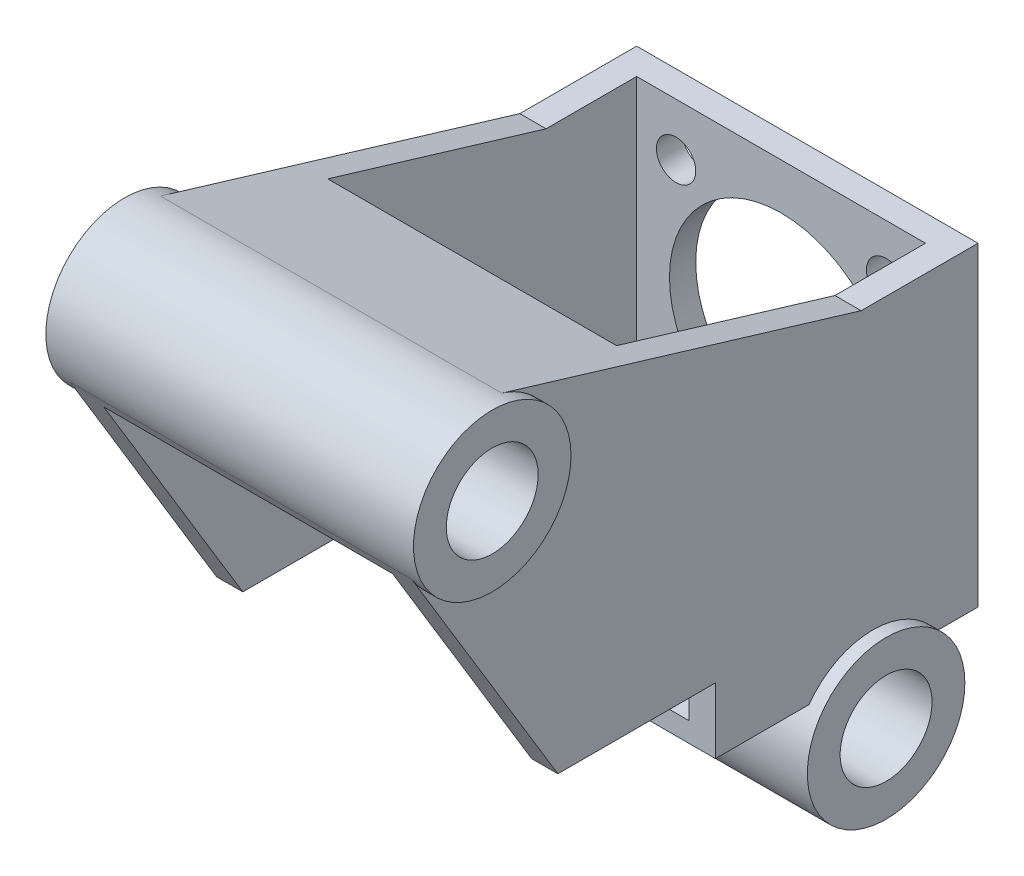
ISO-10303-21;
HEADER;
FILE_DESCRIPTION(('STEP AP214'),'2;1');
FILE_NAME('part.step','',(''),(''),'','','');
FILE_SCHEMA(('AUTOMOTIVE_DESIGN { 1 0 10303 214 1 1 1 1 }'));
ENDSEC;
DATA;
#1=APPLICATION_CONTEXT('core data for automotive mechanical design processes');
#2=APPLICATION_PROTOCOL_DEFINITION('international standard','automotive_design',2000,#1);
#3=PRODUCT_CONTEXT('',#1,'mechanical');
#4=PRODUCT('Part','Part','',(#3));
#5=PRODUCT_RELATED_PRODUCT_CATEGORY('part','',(#4));
#6=PRODUCT_DEFINITION_FORMATION('','',#4);
#7=PRODUCT_DEFINITION_CONTEXT('part definition',#1,'design');
#8=PRODUCT_DEFINITION('design','',#6,#7);
#9=PRODUCT_DEFINITION_SHAPE('','',#8);
#10=(LENGTH_UNIT() NAMED_UNIT(*) SI_UNIT(.MILLI.,.METRE.));
#11=(NAMED_UNIT(*) PLANE_ANGLE_UNIT() SI_UNIT($,.RADIAN.));
#12=(NAMED_UNIT(*) SI_UNIT($,.STERADIAN.) SOLID_ANGLE_UNIT());
#13=UNCERTAINTY_MEASURE_WITH_UNIT(LENGTH_MEASURE(1.E-05),#10,'distance_accuracy_value','');
#14=(GEOMETRIC_REPRESENTATION_CONTEXT(3) GLOBAL_UNCERTAINTY_ASSIGNED_CONTEXT((#13)) GLOBAL_UNIT_ASSIGNED_CONTEXT((#10,
#11,#12)) REPRESENTATION_CONTEXT('',''));
#15=CARTESIAN_POINT('',(0.,0.,0.));
#16=DIRECTION('',(0.,0.,1.));
#17=DIRECTION('',(1.,0.,0.));
#18=AXIS2_PLACEMENT_3D('',#15,#16,#17);
#19=CARTESIAN_POINT('',(13.,12.5,0.899527194270888));
#20=DIRECTION('',(0.,-1.,0.));
#21=DIRECTION('',(0.,0.,-1.));
#22=AXIS2_PLACEMENT_3D('',#19,#20,#21);
#23=PLANE('',#22);
#24=DIRECTION('',(0.,0.,1.));
#25=VECTOR('',#24,1.);
#26=CARTESIAN_POINT('',(11.,12.5,-6.));
#27=LINE('',#26,#25);
#28=CARTESIAN_POINT('',(11.,12.5,-6.));
#29=VERTEX_POINT('',#28);
#30=CARTESIAN_POINT('',(11.,12.5,0.899527194270888));
#31=VERTEX_POINT('',#30);
#32=EDGE_CURVE('E187',#29,#31,#27,.T.);
#33=ORIENTED_EDGE('',*,*,#32,.T.);
#34=DIRECTION('',(-1.,0.,0.));
#35=VECTOR('',#34,1.);
#36=CARTESIAN_POINT('',(13.,12.5,0.899527194270888));
#37=LINE('',#36,#35);
#38=CARTESIAN_POINT('',(13.,12.5,0.899527194270888));
#39=VERTEX_POINT('',#38);
#40=EDGE_CURVE('E300',#39,#31,#37,.T.);
#41=ORIENTED_EDGE('',*,*,#40,.F.);
#42=DIRECTION('',(0.,0.,1.));
#43=VECTOR('',#42,1.);
#44=CARTESIAN_POINT('',(13.,12.5,0.899527194270888));
#45=LINE('',#44,#43);
#46=CARTESIAN_POINT('',(13.,12.5,-8.));
#47=VERTEX_POINT('',#46);
#48=EDGE_CURVE('E237',#47,#39,#45,.T.);
#49=ORIENTED_EDGE('',*,*,#48,.F.);
#50=DIRECTION('',(-1.,0.,0.));
#51=VECTOR('',#50,1.);
#52=CARTESIAN_POINT('',(13.,12.5,-8.));
#53=LINE('',#52,#51);
#54=CARTESIAN_POINT('',(-13.,12.5,-8.));
#55=VERTEX_POINT('',#54);
#56=EDGE_CURVE('E257',#47,#55,#53,.T.);
#57=ORIENTED_EDGE('',*,*,#56,.T.);
#58=DIRECTION('',(0.,0.,1.));
#59=VECTOR('',#58,1.);
#60=CARTESIAN_POINT('',(-13.,12.5,0.899527194270888));
#61=LINE('',#60,#59);
#62=CARTESIAN_POINT('',(-13.,12.5,0.899527194270888));
#63=VERTEX_POINT('',#62);
#64=EDGE_CURVE('E236',#55,#63,#61,.T.);
#65=ORIENTED_EDGE('',*,*,#64,.T.);
#66=CARTESIAN_POINT('',(-11.,12.5,0.899527194270888));
#67=VERTEX_POINT('',#66);
#68=EDGE_CURVE('E299',#67,#63,#37,.T.);
#69=ORIENTED_EDGE('',*,*,#68,.F.);
#70=DIRECTION('',(0.,0.,1.));
#71=VECTOR('',#70,1.);
#72=CARTESIAN_POINT('',(-11.,12.5,-6.));
#73=LINE('',#72,#71);
#74=CARTESIAN_POINT('',(-11.,12.5,-6.));
#75=VERTEX_POINT('',#74);
#76=EDGE_CURVE('E60',#75,#67,#73,.T.);
#77=ORIENTED_EDGE('',*,*,#76,.F.);
#78=DIRECTION('',(-1.,0.,0.));
#79=VECTOR('',#78,1.);
#80=CARTESIAN_POINT('',(11.,12.5,-6.));
#81=LINE('',#80,#79);
#82=EDGE_CURVE('E204',#29,#75,#81,.T.);
#83=ORIENTED_EDGE('',*,*,#82,.F.);
#84=EDGE_LOOP('',(#33,#41,#49,#57,#65,#69,#77,#83));
#85=FACE_BOUND('',#84,.T.);
#86=ADVANCED_FACE('F45',(#85),#23,.F.);
#87=CARTESIAN_POINT('',(13.,12.5,0.899527194270888));
#88=DIRECTION('',(0.,-0.95749792605589,0.288440152542374));
#89=DIRECTION('',(0.,-0.288440152542375,-0.957497926055891));
#90=AXIS2_PLACEMENT_3D('',#87,#88,#89);
#91=PLANE('',#90);
#92=DIRECTION('',(0.,0.288440152542375,0.957497926055891));
#93=VECTOR('',#92,1.);
#94=CARTESIAN_POINT('',(11.,12.5,0.899527194270888));
#95=LINE('',#94,#93);
#96=CARTESIAN_POINT('',(11.,17.5097046211585,17.5296036334629));
#97=VERTEX_POINT('',#96);
#98=EDGE_CURVE('E194',#31,#97,#95,.T.);
#99=ORIENTED_EDGE('',*,*,#98,.T.);
#100=DIRECTION('',(-1.,0.,0.));
#101=VECTOR('',#100,1.);
#102=CARTESIAN_POINT('',(11.,17.5097046211585,17.5296036334629));
#103=LINE('',#102,#101);
#104=CARTESIAN_POINT('',(-11.,17.5097046211585,17.5296036334629));
#105=VERTEX_POINT('',#104);
#106=EDGE_CURVE('E211',#97,#105,#103,.T.);
#107=ORIENTED_EDGE('',*,*,#106,.T.);
#108=DIRECTION('',(0.,0.288440152542375,0.957497926055891));
#109=VECTOR('',#108,1.);
#110=CARTESIAN_POINT('',(-11.,12.5,0.899527194270888));
#111=LINE('',#110,#109);
#112=EDGE_CURVE('E373',#67,#105,#111,.T.);
#113=ORIENTED_EDGE('',*,*,#112,.F.);
#114=ORIENTED_EDGE('',*,*,#68,.T.);
#115=DIRECTION('',(0.,0.288440152542375,0.957497926055891));
#116=VECTOR('',#115,1.);
#117=CARTESIAN_POINT('',(-13.,12.5,0.899527194270888));
#118=LINE('',#117,#116);
#119=CARTESIAN_POINT('',(-13.,20.7449875563353,28.2693590847458));
#120=VERTEX_POINT('',#119);
#121=EDGE_CURVE('E260',#63,#120,#118,.T.);
#122=ORIENTED_EDGE('',*,*,#121,.T.);
#123=DIRECTION('',(-1.,0.,0.));
#124=VECTOR('',#123,1.);
#125=CARTESIAN_POINT('',(13.,20.7449875563353,28.2693590847458));
#126=LINE('',#125,#124);
#127=CARTESIAN_POINT('',(13.,20.7449875563353,28.2693590847458));
#128=VERTEX_POINT('',#127);
#129=EDGE_CURVE('E296',#128,#120,#126,.T.);
#130=ORIENTED_EDGE('',*,*,#129,.F.);
#131=DIRECTION('',(0.,0.288440152542375,0.957497926055891));
#132=VECTOR('',#131,1.);
#133=CARTESIAN_POINT('',(13.,12.5,0.899527194270888));
#134=LINE('',#133,#132);
#135=EDGE_CURVE('E240',#39,#128,#134,.T.);
#136=ORIENTED_EDGE('',*,*,#135,.F.);
#137=ORIENTED_EDGE('',*,*,#40,.T.);
#138=EDGE_LOOP('',(#99,#107,#113,#114,#122,#130,#136,#137));
#139=FACE_BOUND('',#138,.T.);
#140=ADVANCED_FACE('F412',(#139),#91,.F.);
#141=CARTESIAN_POINT('',(13.,15.,30.));
#142=DIRECTION('',(-1.,0.,0.));
#143=DIRECTION('',(0.,0.,1.));
#144=AXIS2_PLACEMENT_3D('',#141,#142,#143);
#145=CYLINDRICAL_SURFACE('',#144,6.);
#146=CARTESIAN_POINT('',(-13.,15.,30.));
#147=DIRECTION('',(-1.,0.,0.));
#148=DIRECTION('',(0.,0.,1.));
#149=AXIS2_PLACEMENT_3D('',#146,#147,#148);
#150=CIRCLE('',#149,6.);
#151=CARTESIAN_POINT('',(-13.,11.8931259407928,35.1329653788259));
#152=VERTEX_POINT('',#151);
#153=EDGE_CURVE('E262',#120,#152,#150,.T.);
#154=ORIENTED_EDGE('',*,*,#153,.T.);
#155=DIRECTION('',(-1.,0.,0.));
#156=VECTOR('',#155,1.);
#157=CARTESIAN_POINT('',(13.,11.8931259407928,35.1329653788259));
#158=LINE('',#157,#156);
#159=CARTESIAN_POINT('',(13.,11.8931259407928,35.1329653788259));
#160=VERTEX_POINT('',#159);
#161=EDGE_CURVE('E293',#160,#152,#158,.T.);
#162=ORIENTED_EDGE('',*,*,#161,.F.);
#163=CARTESIAN_POINT('',(13.,15.,30.));
#164=DIRECTION('',(-1.,0.,0.));
#165=DIRECTION('',(0.,0.,1.));
#166=AXIS2_PLACEMENT_3D('',#163,#164,#165);
#167=CIRCLE('',#166,6.);
#168=EDGE_CURVE('E243',#128,#160,#167,.T.);
#169=ORIENTED_EDGE('',*,*,#168,.F.);
#170=ORIENTED_EDGE('',*,*,#129,.T.);
#171=EDGE_LOOP('',(#154,#162,#169,#170));
#172=FACE_BOUND('',#171,.T.);
#173=CARTESIAN_POINT('',(11.,15.,30.));
#174=DIRECTION('',(-1.,0.,0.));
#175=DIRECTION('',(0.,0.,1.));
#176=AXIS2_PLACEMENT_3D('',#173,#174,#175);
#177=CIRCLE('',#176,6.);
#178=CARTESIAN_POINT('',(11.,11.,34.4721359549996));
#179=VERTEX_POINT('',#178);
#180=CARTESIAN_POINT('',(11.,11.,25.5278640450004));
#181=VERTEX_POINT('',#180);
#182=EDGE_CURVE('E230',#179,#181,#177,.F.);
#183=ORIENTED_EDGE('',*,*,#182,.F.);
#184=DIRECTION('',(-1.,0.,0.));
#185=VECTOR('',#184,1.);
#186=CARTESIAN_POINT('',(13.,11.,34.4721359549996));
#187=LINE('',#186,#185);
#188=CARTESIAN_POINT('',(-11.,11.,34.4721359549996));
#189=VERTEX_POINT('',#188);
#190=EDGE_CURVE('E234',#189,#179,#187,.F.);
#191=ORIENTED_EDGE('',*,*,#190,.F.);
#192=CARTESIAN_POINT('',(-11.,15.,30.));
#193=DIRECTION('',(-1.,0.,0.));
#194=DIRECTION('',(0.,0.,1.));
#195=AXIS2_PLACEMENT_3D('',#192,#193,#194);
#196=CIRCLE('',#195,6.);
#197=CARTESIAN_POINT('',(-11.,11.,25.5278640450004));
#198=VERTEX_POINT('',#197);
#199=EDGE_CURVE('E223',#189,#198,#196,.F.);
#200=ORIENTED_EDGE('',*,*,#199,.T.);
#201=DIRECTION('',(-1.,0.,0.));
#202=VECTOR('',#201,1.);
#203=CARTESIAN_POINT('',(13.,11.,25.5278640450004));
#204=LINE('',#203,#202);
#205=EDGE_CURVE('E232',#181,#198,#204,.T.);
#206=ORIENTED_EDGE('',*,*,#205,.F.);
#207=EDGE_LOOP('',(#183,#191,#200,#206));
#208=FACE_BOUND('',#207,.T.);
#209=ADVANCED_FACE('F390',(#172,#208),#145,.F.);
#210=CARTESIAN_POINT('',(13.,-6.5,24.));
#211=DIRECTION('',(0.,0.517812343201205,-0.855494229804315));
#212=DIRECTION('',(0.,0.855494229804315,0.517812343201205));
#213=AXIS2_PLACEMENT_3D('',#210,#211,#212);
#214=PLANE('',#213);
#215=DIRECTION('',(0.,0.855494229804315,0.517812343201205));
#216=VECTOR('',#215,1.);
#217=CARTESIAN_POINT('',(11.,-6.5,24.));
#218=LINE('',#217,#216);
#219=CARTESIAN_POINT('',(11.,-6.5,24.));
#220=VERTEX_POINT('',#219);
#221=CARTESIAN_POINT('',(11.,11.,34.5923753665689));
#222=VERTEX_POINT('',#221);
#223=EDGE_CURVE('E228',#220,#222,#218,.T.);
#224=ORIENTED_EDGE('',*,*,#223,.F.);
#225=DIRECTION('',(-1.,0.,0.));
#226=VECTOR('',#225,1.);
#227=CARTESIAN_POINT('',(13.,-6.5,24.));
#228=LINE('',#227,#226);
#229=CARTESIAN_POINT('',(13.,-6.5,24.));
#230=VERTEX_POINT('',#229);
#231=EDGE_CURVE('E290',#230,#220,#228,.T.);
#232=ORIENTED_EDGE('',*,*,#231,.F.);
#233=DIRECTION('',(0.,-0.855494229804315,-0.517812343201205));
#234=VECTOR('',#233,1.);
#235=CARTESIAN_POINT('',(13.,-6.5,24.));
#236=LINE('',#235,#234);
#237=EDGE_CURVE('E245',#160,#230,#236,.T.);
#238=ORIENTED_EDGE('',*,*,#237,.F.);
#239=ORIENTED_EDGE('',*,*,#161,.T.);
#240=DIRECTION('',(0.,-0.855494229804315,-0.517812343201205));
#241=VECTOR('',#240,1.);
#242=CARTESIAN_POINT('',(-13.,-6.5,24.));
#243=LINE('',#242,#241);
#244=CARTESIAN_POINT('',(-13.,-6.5,24.));
#245=VERTEX_POINT('',#244);
#246=EDGE_CURVE('E264',#152,#245,#243,.T.);
#247=ORIENTED_EDGE('',*,*,#246,.T.);
#248=CARTESIAN_POINT('',(-11.,-6.5,24.));
#249=VERTEX_POINT('',#248);
#250=EDGE_CURVE('E289',#249,#245,#228,.T.);
#251=ORIENTED_EDGE('',*,*,#250,.F.);
#252=DIRECTION('',(0.,0.855494229804315,0.517812343201205));
#253=VECTOR('',#252,1.);
#254=CARTESIAN_POINT('',(-11.,-6.5,24.));
#255=LINE('',#254,#253);
#256=CARTESIAN_POINT('',(-11.,11.,34.5923753665689));
#257=VERTEX_POINT('',#256);
#258=EDGE_CURVE('E214',#249,#257,#255,.T.);
#259=ORIENTED_EDGE('',*,*,#258,.T.);
#260=DIRECTION('',(-1.,0.,0.));
#261=VECTOR('',#260,1.);
#262=CARTESIAN_POINT('',(13.,11.,34.5923753665689));
#263=LINE('',#262,#261);
#264=EDGE_CURVE('E12',#222,#257,#263,.T.);
#265=ORIENTED_EDGE('',*,*,#264,.F.);
#266=EDGE_LOOP('',(#224,#232,#238,#239,#247,#251,#259,#265));
#267=FACE_BOUND('',#266,.T.);
#268=ADVANCED_FACE('F350',(#267),#214,.F.);
#269=CARTESIAN_POINT('',(13.,-6.5,12.));
#270=DIRECTION('',(0.,1.,0.));
#271=DIRECTION('',(0.,0.,1.));
#272=AXIS2_PLACEMENT_3D('',#269,#270,#271);
#273=PLANE('',#272);
#274=DIRECTION('',(0.,0.,1.));
#275=VECTOR('',#274,1.);
#276=CARTESIAN_POINT('',(11.,-6.5,12.));
#277=LINE('',#276,#275);
#278=CARTESIAN_POINT('',(11.,-6.5,12.));
#279=VERTEX_POINT('',#278);
#280=EDGE_CURVE('E226',#279,#220,#277,.T.);
#281=ORIENTED_EDGE('',*,*,#280,.F.);
#282=DIRECTION('',(-1.,0.,0.));
#283=VECTOR('',#282,1.);
#284=CARTESIAN_POINT('',(13.,-6.5,12.));
#285=LINE('',#284,#283);
#286=CARTESIAN_POINT('',(13.,-6.5,12.));
#287=VERTEX_POINT('',#286);
#288=EDGE_CURVE('E286',#287,#279,#285,.T.);
#289=ORIENTED_EDGE('',*,*,#288,.F.);
#290=DIRECTION('',(0.,0.,-1.));
#291=VECTOR('',#290,1.);
#292=CARTESIAN_POINT('',(13.,-6.5,12.));
#293=LINE('',#292,#291);
#294=EDGE_CURVE('E247',#230,#287,#293,.T.);
#295=ORIENTED_EDGE('',*,*,#294,.F.);
#296=ORIENTED_EDGE('',*,*,#231,.T.);
#297=EDGE_LOOP('',(#281,#289,#295,#296));
#298=FACE_BOUND('',#297,.T.);
#299=ADVANCED_FACE('F336',(#298),#273,.F.);
#300=CARTESIAN_POINT('',(13.,-11.5,12.));
#301=DIRECTION('',(0.,0.,-1.));
#302=DIRECTION('',(-1.,0.,0.));
#303=AXIS2_PLACEMENT_3D('',#300,#301,#302);
#304=PLANE('',#303);
#305=DIRECTION('',(0.,1.,0.));
#306=VECTOR('',#305,1.);
#307=CARTESIAN_POINT('',(11.,-11.5,12.));
#308=LINE('',#307,#306);
#309=CARTESIAN_POINT('',(11.,-10.,12.));
#310=VERTEX_POINT('',#309);
#311=EDGE_CURVE('E53',#310,#279,#308,.T.);
#312=ORIENTED_EDGE('',*,*,#311,.F.);
#313=DIRECTION('',(1.,0.,0.));
#314=VECTOR('',#313,1.);
#315=CARTESIAN_POINT('',(13.,-10.,12.));
#316=LINE('',#315,#314);
#317=CARTESIAN_POINT('',(-11.,-10.,12.));
#318=VERTEX_POINT('',#317);
#319=EDGE_CURVE('E327',#318,#310,#316,.T.);
#320=ORIENTED_EDGE('',*,*,#319,.F.);
#321=DIRECTION('',(0.,1.,0.));
#322=VECTOR('',#321,1.);
#323=CARTESIAN_POINT('',(-11.,-11.5,12.));
#324=LINE('',#323,#322);
#325=CARTESIAN_POINT('',(-11.,-6.5,12.));
#326=VERTEX_POINT('',#325);
#327=EDGE_CURVE('E322',#318,#326,#324,.T.);
#328=ORIENTED_EDGE('',*,*,#327,.T.);
#329=CARTESIAN_POINT('',(-13.,-6.5,12.));
#330=VERTEX_POINT('',#329);
#331=EDGE_CURVE('E285',#326,#330,#285,.T.);
#332=ORIENTED_EDGE('',*,*,#331,.T.);
#333=DIRECTION('',(0.,-1.,0.));
#334=VECTOR('',#333,1.);
#335=CARTESIAN_POINT('',(-13.,-11.5,12.));
#336=LINE('',#335,#334);
#337=CARTESIAN_POINT('',(-13.,-11.5,12.));
#338=VERTEX_POINT('',#337);
#339=EDGE_CURVE('E270',#330,#338,#336,.T.);
#340=ORIENTED_EDGE('',*,*,#339,.T.);
#341=DIRECTION('',(-1.,0.,0.));
#342=VECTOR('',#341,1.);
#343=CARTESIAN_POINT('',(13.,-11.5,12.));
#344=LINE('',#343,#342);
#345=CARTESIAN_POINT('',(13.,-11.5,12.));
#346=VERTEX_POINT('',#345);
#347=EDGE_CURVE('E282',#346,#338,#344,.T.);
#348=ORIENTED_EDGE('',*,*,#347,.F.);
#349=DIRECTION('',(0.,-1.,0.));
#350=VECTOR('',#349,1.);
#351=CARTESIAN_POINT('',(13.,-11.5,12.));
#352=LINE('',#351,#350);
#353=EDGE_CURVE('E249',#287,#346,#352,.T.);
#354=ORIENTED_EDGE('',*,*,#353,.F.);
#355=ORIENTED_EDGE('',*,*,#288,.T.);
#356=EDGE_LOOP('',(#312,#320,#328,#332,#340,#348,#354,#355));
#357=FACE_BOUND('',#356,.T.);
#358=ADVANCED_FACE('F340',(#357),#304,.F.);
#359=CARTESIAN_POINT('',(14.,-15.,0.));
#360=DIRECTION('',(-1.,0.,0.));
#361=DIRECTION('',(0.,0.,1.));
#362=AXIS2_PLACEMENT_3D('',#359,#360,#361);
#363=CYLINDRICAL_SURFACE('',#362,6.);
#364=CARTESIAN_POINT('',(-14.,-15.,0.));
#365=DIRECTION('',(1.,0.,0.));
#366=DIRECTION('',(0.,0.,-1.));
#367=AXIS2_PLACEMENT_3D('',#364,#365,#366);
#368=CIRCLE('',#367,6.);
#369=CARTESIAN_POINT('',(-14.,-15.,-6.));
#370=VERTEX_POINT('',#369);
#371=EDGE_CURVE('E316',#370,#370,#368,.T.);
#372=ORIENTED_EDGE('',*,*,#371,.T.);
#373=EDGE_LOOP('',(#372));
#374=FACE_BOUND('',#373,.T.);
#375=CARTESIAN_POINT('',(14.,-15.,0.));
#376=DIRECTION('',(1.,0.,0.));
#377=DIRECTION('',(0.,0.,-1.));
#378=AXIS2_PLACEMENT_3D('',#375,#376,#377);
#379=CIRCLE('',#378,6.);
#380=CARTESIAN_POINT('',(14.,-15.,-6.));
#381=VERTEX_POINT('',#380);
#382=EDGE_CURVE('E319',#381,#381,#379,.T.);
#383=ORIENTED_EDGE('',*,*,#382,.F.);
#384=EDGE_LOOP('',(#383));
#385=FACE_BOUND('',#384,.T.);
#386=CARTESIAN_POINT('',(13.,-15.,0.));
#387=DIRECTION('',(-1.,0.,0.));
#388=DIRECTION('',(0.,0.,1.));
#389=AXIS2_PLACEMENT_3D('',#386,#387,#388);
#390=CIRCLE('',#389,6.);
#391=CARTESIAN_POINT('',(13.,-11.5,4.87339717240448));
#392=VERTEX_POINT('',#391);
#393=CARTESIAN_POINT('',(13.,-11.5,-4.87339717240449));
#394=VERTEX_POINT('',#393);
#395=EDGE_CURVE('E305',#392,#394,#390,.T.);
#396=ORIENTED_EDGE('',*,*,#395,.F.);
#397=DIRECTION('',(-1.,0.,0.));
#398=VECTOR('',#397,1.);
#399=CARTESIAN_POINT('',(14.,-11.5,4.87339717240448));
#400=LINE('',#399,#398);
#401=CARTESIAN_POINT('',(-13.,-11.5,4.87339717240448));
#402=VERTEX_POINT('',#401);
#403=EDGE_CURVE('E307',#402,#392,#400,.F.);
#404=ORIENTED_EDGE('',*,*,#403,.F.);
#405=CARTESIAN_POINT('',(-13.,-15.,0.));
#406=DIRECTION('',(-1.,0.,0.));
#407=DIRECTION('',(0.,0.,1.));
#408=AXIS2_PLACEMENT_3D('',#405,#406,#407);
#409=CIRCLE('',#408,6.);
#410=CARTESIAN_POINT('',(-13.,-11.5,-4.87339717240449));
#411=VERTEX_POINT('',#410);
#412=EDGE_CURVE('E302',#402,#411,#409,.T.);
#413=ORIENTED_EDGE('',*,*,#412,.T.);
#414=DIRECTION('',(-1.,0.,0.));
#415=VECTOR('',#414,1.);
#416=CARTESIAN_POINT('',(14.,-11.5,-4.87339717240449));
#417=LINE('',#416,#415);
#418=EDGE_CURVE('E309',#394,#411,#417,.T.);
#419=ORIENTED_EDGE('',*,*,#418,.F.);
#420=EDGE_LOOP('',(#396,#404,#413,#419));
#421=FACE_BOUND('',#420,.T.);
#422=ADVANCED_FACE('F47',(#374,#385,#421),#363,.T.);
#423=CARTESIAN_POINT('',(14.,-15.,0.));
#424=DIRECTION('',(1.,0.,0.));
#425=DIRECTION('',(0.,0.,-1.));
#426=AXIS2_PLACEMENT_3D('',#423,#424,#425);
#427=PLANE('',#426);
#428=ORIENTED_EDGE('',*,*,#382,.T.);
#429=EDGE_LOOP('',(#428));
#430=FACE_BOUND('',#429,.T.);
#431=CARTESIAN_POINT('',(14.,-15.,0.));
#432=DIRECTION('',(1.,0.,0.));
#433=DIRECTION('',(0.,0.,-1.));
#434=AXIS2_PLACEMENT_3D('',#431,#432,#433);
#435=CIRCLE('',#434,3.5);
#436=CARTESIAN_POINT('',(14.,-15.,-3.5));
#437=VERTEX_POINT('',#436);
#438=EDGE_CURVE('E313',#437,#437,#435,.T.);
#439=ORIENTED_EDGE('',*,*,#438,.F.);
#440=EDGE_LOOP('',(#439));
#441=FACE_BOUND('',#440,.T.);
#442=ADVANCED_FACE('F427',(#430,#441),#427,.T.);
#443=CARTESIAN_POINT('',(-14.,-15.,0.));
#444=DIRECTION('',(1.,0.,0.));
#445=DIRECTION('',(0.,0.,-1.));
#446=AXIS2_PLACEMENT_3D('',#443,#444,#445);
#447=PLANE('',#446);
#448=ORIENTED_EDGE('',*,*,#371,.F.);
#449=EDGE_LOOP('',(#448));
#450=FACE_BOUND('',#449,.T.);
#451=CARTESIAN_POINT('',(-14.,-15.,0.));
#452=DIRECTION('',(1.,0.,0.));
#453=DIRECTION('',(0.,0.,-1.));
#454=AXIS2_PLACEMENT_3D('',#451,#452,#453);
#455=CIRCLE('',#454,3.5);
#456=CARTESIAN_POINT('',(-14.,-15.,-3.5));
#457=VERTEX_POINT('',#456);
#458=EDGE_CURVE('E312',#457,#457,#455,.T.);
#459=ORIENTED_EDGE('',*,*,#458,.T.);
#460=EDGE_LOOP('',(#459));
#461=FACE_BOUND('',#460,.T.);
#462=ADVANCED_FACE('F425',(#450,#461),#447,.F.);
#463=CARTESIAN_POINT('',(14.,-15.,0.));
#464=DIRECTION('',(-1.,0.,0.));
#465=DIRECTION('',(0.,0.,1.));
#466=AXIS2_PLACEMENT_3D('',#463,#464,#465);
#467=CYLINDRICAL_SURFACE('',#466,3.5);
#468=ORIENTED_EDGE('',*,*,#438,.T.);
#469=EDGE_LOOP('',(#468));
#470=FACE_BOUND('',#469,.T.);
#471=ORIENTED_EDGE('',*,*,#458,.F.);
#472=EDGE_LOOP('',(#471));
#473=FACE_BOUND('',#472,.T.);
#474=ADVANCED_FACE('F421',(#470,#473),#467,.F.);
#475=CARTESIAN_POINT('',(13.,-11.5,-8.));
#476=DIRECTION('',(0.,1.,0.));
#477=DIRECTION('',(0.,0.,1.));
#478=AXIS2_PLACEMENT_3D('',#475,#476,#477);
#479=PLANE('',#478);
#480=DIRECTION('',(0.,0.,-1.));
#481=VECTOR('',#480,1.);
#482=CARTESIAN_POINT('',(13.,-11.5,-8.));
#483=LINE('',#482,#481);
#484=CARTESIAN_POINT('',(13.,-11.5,-8.));
#485=VERTEX_POINT('',#484);
#486=EDGE_CURVE('E251',#394,#485,#483,.T.);
#487=ORIENTED_EDGE('',*,*,#486,.F.);
#488=ORIENTED_EDGE('',*,*,#418,.T.);
#489=DIRECTION('',(0.,0.,-1.));
#490=VECTOR('',#489,1.);
#491=CARTESIAN_POINT('',(-13.,-11.5,-8.));
#492=LINE('',#491,#490);
#493=CARTESIAN_POINT('',(-13.,-11.5,-8.));
#494=VERTEX_POINT('',#493);
#495=EDGE_CURVE('E272',#411,#494,#492,.T.);
#496=ORIENTED_EDGE('',*,*,#495,.T.);
#497=DIRECTION('',(-1.,0.,0.));
#498=VECTOR('',#497,1.);
#499=CARTESIAN_POINT('',(13.,-11.5,-8.));
#500=LINE('',#499,#498);
#501=EDGE_CURVE('E279',#485,#494,#500,.T.);
#502=ORIENTED_EDGE('',*,*,#501,.F.);
#503=EDGE_LOOP('',(#487,#488,#496,#502));
#504=FACE_BOUND('',#503,.T.);
#505=ADVANCED_FACE('F424',(#504),#479,.F.);
#506=EDGE_CURVE('E273',#338,#402,#492,.T.);
#507=ORIENTED_EDGE('',*,*,#506,.T.);
#508=ORIENTED_EDGE('',*,*,#403,.T.);
#509=EDGE_CURVE('E252',#346,#392,#483,.T.);
#510=ORIENTED_EDGE('',*,*,#509,.F.);
#511=ORIENTED_EDGE('',*,*,#347,.T.);
#512=EDGE_LOOP('',(#507,#508,#510,#511));
#513=FACE_BOUND('',#512,.T.);
#514=ADVANCED_FACE('F462',(#513),#479,.F.);
#515=CARTESIAN_POINT('',(13.,15.,30.));
#516=DIRECTION('',(-1.,0.,0.));
#517=DIRECTION('',(0.,0.,1.));
#518=AXIS2_PLACEMENT_3D('',#515,#516,#517);
#519=PLANE('',#518);
#520=ORIENTED_EDGE('',*,*,#509,.T.);
#521=ORIENTED_EDGE('',*,*,#395,.T.);
#522=ORIENTED_EDGE('',*,*,#486,.T.);
#523=DIRECTION('',(0.,1.,0.));
#524=VECTOR('',#523,1.);
#525=CARTESIAN_POINT('',(13.,12.5,-8.));
#526=LINE('',#525,#524);
#527=EDGE_CURVE('E255',#485,#47,#526,.T.);
#528=ORIENTED_EDGE('',*,*,#527,.T.);
#529=ORIENTED_EDGE('',*,*,#48,.T.);
#530=ORIENTED_EDGE('',*,*,#135,.T.);
#531=ORIENTED_EDGE('',*,*,#168,.T.);
#532=ORIENTED_EDGE('',*,*,#237,.T.);
#533=ORIENTED_EDGE('',*,*,#294,.T.);
#534=ORIENTED_EDGE('',*,*,#353,.T.);
#535=EDGE_LOOP('',(#520,#521,#522,#528,#529,#530,#531,#532,#533,#534));
#536=FACE_BOUND('',#535,.T.);
#537=ADVANCED_FACE('F344',(#536),#519,.F.);
#538=CARTESIAN_POINT('',(-13.,15.,30.));
#539=DIRECTION('',(-1.,0.,0.));
#540=DIRECTION('',(0.,0.,1.));
#541=AXIS2_PLACEMENT_3D('',#538,#539,#540);
#542=PLANE('',#541);
#543=ORIENTED_EDGE('',*,*,#412,.F.);
#544=ORIENTED_EDGE('',*,*,#506,.F.);
#545=ORIENTED_EDGE('',*,*,#339,.F.);
#546=DIRECTION('',(0.,0.,-1.));
#547=VECTOR('',#546,1.);
#548=CARTESIAN_POINT('',(-13.,-6.5,12.));
#549=LINE('',#548,#547);
#550=EDGE_CURVE('E267',#245,#330,#549,.T.);
#551=ORIENTED_EDGE('',*,*,#550,.F.);
#552=ORIENTED_EDGE('',*,*,#246,.F.);
#553=ORIENTED_EDGE('',*,*,#153,.F.);
#554=ORIENTED_EDGE('',*,*,#121,.F.);
#555=ORIENTED_EDGE('',*,*,#64,.F.);
#556=DIRECTION('',(0.,1.,0.));
#557=VECTOR('',#556,1.);
#558=CARTESIAN_POINT('',(-13.,12.5,-8.));
#559=LINE('',#558,#557);
#560=EDGE_CURVE('E241',#494,#55,#559,.T.);
#561=ORIENTED_EDGE('',*,*,#560,.F.);
#562=ORIENTED_EDGE('',*,*,#495,.F.);
#563=EDGE_LOOP('',(#543,#544,#545,#551,#552,#553,#554,#555,#561,#562));
#564=FACE_BOUND('',#563,.T.);
#565=ADVANCED_FACE('F459',(#564),#542,.T.);
#566=ORIENTED_EDGE('',*,*,#331,.F.);
#567=DIRECTION('',(0.,0.,1.));
#568=VECTOR('',#567,1.);
#569=CARTESIAN_POINT('',(-11.,-6.5,12.));
#570=LINE('',#569,#568);
#571=EDGE_CURVE('E210',#326,#249,#570,.T.);
#572=ORIENTED_EDGE('',*,*,#571,.T.);
#573=ORIENTED_EDGE('',*,*,#250,.T.);
#574=ORIENTED_EDGE('',*,*,#550,.T.);
#575=EDGE_LOOP('',(#566,#572,#573,#574));
#576=FACE_BOUND('',#575,.T.);
#577=ADVANCED_FACE('F397',(#576),#273,.F.);
#578=CARTESIAN_POINT('',(13.,12.5,-8.));
#579=DIRECTION('',(0.,0.,1.));
#580=DIRECTION('',(0.,-1.,0.));
#581=AXIS2_PLACEMENT_3D('',#578,#579,#580);
#582=PLANE('',#581);
#583=CARTESIAN_POINT('',(-8.,-7.5,-8.));
#584=DIRECTION('',(0.,0.,-1.));
#585=DIRECTION('',(0.,1.,0.));
#586=AXIS2_PLACEMENT_3D('',#583,#584,#585);
#587=CIRCLE('',#586,1.5);
#588=CARTESIAN_POINT('',(-8.,-6.,-8.));
#589=VERTEX_POINT('',#588);
#590=EDGE_CURVE('E665',#589,#589,#587,.T.);
#591=ORIENTED_EDGE('',*,*,#590,.F.);
#592=EDGE_LOOP('',(#591));
#593=FACE_BOUND('',#592,.T.);
#594=CARTESIAN_POINT('',(-8.,8.5,-8.));
#595=DIRECTION('',(0.,0.,-1.));
#596=DIRECTION('',(0.,1.,0.));
#597=AXIS2_PLACEMENT_3D('',#594,#595,#596);
#598=CIRCLE('',#597,1.5);
#599=CARTESIAN_POINT('',(-8.,10.,-8.));
#600=VERTEX_POINT('',#599);
#601=EDGE_CURVE('E669',#600,#600,#598,.T.);
#602=ORIENTED_EDGE('',*,*,#601,.F.);
#603=EDGE_LOOP('',(#602));
#604=FACE_BOUND('',#603,.T.);
#605=CARTESIAN_POINT('',(0.,0.5,-8.));
#606=DIRECTION('',(0.,0.,-1.));
#607=DIRECTION('',(0.,1.,0.));
#608=AXIS2_PLACEMENT_3D('',#605,#606,#607);
#609=CIRCLE('',#608,8.5);
#610=CARTESIAN_POINT('',(0.,9.,-8.));
#611=VERTEX_POINT('',#610);
#612=EDGE_CURVE('E678',#611,#611,#609,.T.);
#613=ORIENTED_EDGE('',*,*,#612,.F.);
#614=EDGE_LOOP('',(#613));
#615=FACE_BOUND('',#614,.T.);
#616=CARTESIAN_POINT('',(8.,-7.5,-8.));
#617=DIRECTION('',(0.,0.,-1.));
#618=DIRECTION('',(0.,1.,0.));
#619=AXIS2_PLACEMENT_3D('',#616,#617,#618);
#620=CIRCLE('',#619,1.5);
#621=CARTESIAN_POINT('',(8.,-6.,-8.));
#622=VERTEX_POINT('',#621);
#623=EDGE_CURVE('E684',#622,#622,#620,.T.);
#624=ORIENTED_EDGE('',*,*,#623,.F.);
#625=EDGE_LOOP('',(#624));
#626=FACE_BOUND('',#625,.T.);
#627=CARTESIAN_POINT('',(8.,8.5,-8.));
#628=DIRECTION('',(0.,0.,-1.));
#629=DIRECTION('',(0.,1.,0.));
#630=AXIS2_PLACEMENT_3D('',#627,#628,#629);
#631=CIRCLE('',#630,1.5);
#632=CARTESIAN_POINT('',(8.,10.,-8.));
#633=VERTEX_POINT('',#632);
#634=EDGE_CURVE('E690',#633,#633,#631,.T.);
#635=ORIENTED_EDGE('',*,*,#634,.F.);
#636=EDGE_LOOP('',(#635));
#637=FACE_BOUND('',#636,.T.);
#638=ORIENTED_EDGE('',*,*,#560,.T.);
#639=ORIENTED_EDGE('',*,*,#56,.F.);
#640=ORIENTED_EDGE('',*,*,#527,.F.);
#641=ORIENTED_EDGE('',*,*,#501,.T.);
#642=EDGE_LOOP('',(#638,#639,#640,#641));
#643=FACE_BOUND('',#642,.T.);
#644=ADVANCED_FACE('F452',(#593,#604,#615,#626,#637,#643),#582,.F.);
#645=CARTESIAN_POINT('',(11.,11.,17.5296036334629));
#646=DIRECTION('',(0.,-1.,0.));
#647=DIRECTION('',(0.,0.,-1.));
#648=AXIS2_PLACEMENT_3D('',#645,#646,#647);
#649=PLANE('',#648);
#650=ORIENTED_EDGE('',*,*,#190,.T.);
#651=DIRECTION('',(0.,0.,1.));
#652=VECTOR('',#651,1.);
#653=CARTESIAN_POINT('',(11.,11.,17.5296036334629));
#654=LINE('',#653,#652);
#655=EDGE_CURVE('E354',#179,#222,#654,.T.);
#656=ORIENTED_EDGE('',*,*,#655,.T.);
#657=ORIENTED_EDGE('',*,*,#264,.T.);
#658=DIRECTION('',(0.,0.,1.));
#659=VECTOR('',#658,1.);
#660=CARTESIAN_POINT('',(-11.,11.,17.5296036334629));
#661=LINE('',#660,#659);
#662=EDGE_CURVE('E377',#189,#257,#661,.T.);
#663=ORIENTED_EDGE('',*,*,#662,.F.);
#664=EDGE_LOOP('',(#650,#656,#657,#663));
#665=FACE_BOUND('',#664,.T.);
#666=ADVANCED_FACE('F357',(#665),#649,.T.);
#667=ORIENTED_EDGE('',*,*,#205,.T.);
#668=CARTESIAN_POINT('',(-11.,11.,17.5296036334629));
#669=VERTEX_POINT('',#668);
#670=EDGE_CURVE('E67',#669,#198,#661,.T.);
#671=ORIENTED_EDGE('',*,*,#670,.F.);
#672=DIRECTION('',(-1.,0.,0.));
#673=VECTOR('',#672,1.);
#674=CARTESIAN_POINT('',(11.,11.,17.5296036334629));
#675=LINE('',#674,#673);
#676=CARTESIAN_POINT('',(11.,11.,17.5296036334629));
#677=VERTEX_POINT('',#676);
#678=EDGE_CURVE('E217',#677,#669,#675,.T.);
#679=ORIENTED_EDGE('',*,*,#678,.F.);
#680=EDGE_CURVE('E361',#677,#181,#654,.T.);
#681=ORIENTED_EDGE('',*,*,#680,.T.);
#682=EDGE_LOOP('',(#667,#671,#679,#681));
#683=FACE_BOUND('',#682,.T.);
#684=ADVANCED_FACE('F387',(#683),#649,.T.);
#685=CARTESIAN_POINT('',(11.,-10.,-6.));
#686=DIRECTION('',(0.,1.,0.));
#687=DIRECTION('',(0.,0.,1.));
#688=AXIS2_PLACEMENT_3D('',#685,#686,#687);
#689=PLANE('',#688);
#690=ORIENTED_EDGE('',*,*,#319,.T.);
#691=DIRECTION('',(0.,0.,-1.));
#692=VECTOR('',#691,1.);
#693=CARTESIAN_POINT('',(11.,-10.,-6.));
#694=LINE('',#693,#692);
#695=CARTESIAN_POINT('',(11.,-10.,-6.));
#696=VERTEX_POINT('',#695);
#697=EDGE_CURVE('E331',#310,#696,#694,.T.);
#698=ORIENTED_EDGE('',*,*,#697,.T.);
#699=DIRECTION('',(-1.,0.,0.));
#700=VECTOR('',#699,1.);
#701=CARTESIAN_POINT('',(11.,-10.,-6.));
#702=LINE('',#701,#700);
#703=CARTESIAN_POINT('',(-11.,-10.,-6.));
#704=VERTEX_POINT('',#703);
#705=EDGE_CURVE('E206',#696,#704,#702,.T.);
#706=ORIENTED_EDGE('',*,*,#705,.T.);
#707=DIRECTION('',(0.,0.,-1.));
#708=VECTOR('',#707,1.);
#709=CARTESIAN_POINT('',(-11.,-10.,-6.));
#710=LINE('',#709,#708);
#711=EDGE_CURVE('E207',#318,#704,#710,.T.);
#712=ORIENTED_EDGE('',*,*,#711,.F.);
#713=EDGE_LOOP('',(#690,#698,#706,#712));
#714=FACE_BOUND('',#713,.T.);
#715=ADVANCED_FACE('F401',(#714),#689,.T.);
#716=CARTESIAN_POINT('',(11.,-10.,-6.));
#717=DIRECTION('',(-1.,0.,0.));
#718=DIRECTION('',(0.,0.,1.));
#719=AXIS2_PLACEMENT_3D('',#716,#717,#718);
#720=PLANE('',#719);
#721=ORIENTED_EDGE('',*,*,#182,.T.);
#722=ORIENTED_EDGE('',*,*,#680,.F.);
#723=DIRECTION('',(0.,-1.,0.));
#724=VECTOR('',#723,1.);
#725=CARTESIAN_POINT('',(11.,11.,17.5296036334629));
#726=LINE('',#725,#724);
#727=EDGE_CURVE('E362',#97,#677,#726,.T.);
#728=ORIENTED_EDGE('',*,*,#727,.F.);
#729=ORIENTED_EDGE('',*,*,#98,.F.);
#730=ORIENTED_EDGE('',*,*,#32,.F.);
#731=DIRECTION('',(0.,1.,0.));
#732=VECTOR('',#731,1.);
#733=CARTESIAN_POINT('',(11.,12.5,-6.));
#734=LINE('',#733,#732);
#735=EDGE_CURVE('E191',#696,#29,#734,.T.);
#736=ORIENTED_EDGE('',*,*,#735,.F.);
#737=ORIENTED_EDGE('',*,*,#697,.F.);
#738=ORIENTED_EDGE('',*,*,#311,.T.);
#739=ORIENTED_EDGE('',*,*,#280,.T.);
#740=ORIENTED_EDGE('',*,*,#223,.T.);
#741=ORIENTED_EDGE('',*,*,#655,.F.);
#742=EDGE_LOOP('',(#721,#722,#728,#729,#730,#736,#737,#738,#739,#740,#741));
#743=FACE_BOUND('',#742,.T.);
#744=ADVANCED_FACE('F189',(#743),#720,.T.);
#745=CARTESIAN_POINT('',(-11.,-10.,-6.));
#746=DIRECTION('',(-1.,0.,0.));
#747=DIRECTION('',(0.,0.,1.));
#748=AXIS2_PLACEMENT_3D('',#745,#746,#747);
#749=PLANE('',#748);
#750=ORIENTED_EDGE('',*,*,#662,.T.);
#751=ORIENTED_EDGE('',*,*,#258,.F.);
#752=ORIENTED_EDGE('',*,*,#571,.F.);
#753=ORIENTED_EDGE('',*,*,#327,.F.);
#754=ORIENTED_EDGE('',*,*,#711,.T.);
#755=DIRECTION('',(0.,1.,0.));
#756=VECTOR('',#755,1.);
#757=CARTESIAN_POINT('',(-11.,12.5,-6.));
#758=LINE('',#757,#756);
#759=EDGE_CURVE('E369',#704,#75,#758,.T.);
#760=ORIENTED_EDGE('',*,*,#759,.T.);
#761=ORIENTED_EDGE('',*,*,#76,.T.);
#762=ORIENTED_EDGE('',*,*,#112,.T.);
#763=DIRECTION('',(0.,-1.,0.));
#764=VECTOR('',#763,1.);
#765=CARTESIAN_POINT('',(-11.,11.,17.5296036334629));
#766=LINE('',#765,#764);
#767=EDGE_CURVE('E375',#105,#669,#766,.T.);
#768=ORIENTED_EDGE('',*,*,#767,.T.);
#769=ORIENTED_EDGE('',*,*,#670,.T.);
#770=ORIENTED_EDGE('',*,*,#199,.F.);
#771=EDGE_LOOP('',(#750,#751,#752,#753,#754,#760,#761,#762,#768,#769,#770));
#772=FACE_BOUND('',#771,.T.);
#773=ADVANCED_FACE('F391',(#772),#749,.F.);
#774=CARTESIAN_POINT('',(11.,12.5,-6.));
#775=DIRECTION('',(0.,0.,1.));
#776=DIRECTION('',(0.,-1.,0.));
#777=AXIS2_PLACEMENT_3D('',#774,#775,#776);
#778=PLANE('',#777);
#779=CARTESIAN_POINT('',(-8.,-7.5,-6.00000000000001));
#780=DIRECTION('',(0.,0.,1.));
#781=DIRECTION('',(0.,-1.,0.));
#782=AXIS2_PLACEMENT_3D('',#779,#780,#781);
#783=CIRCLE('',#782,1.5);
#784=CARTESIAN_POINT('',(-8.,-9.,-6.00000000000001));
#785=VERTEX_POINT('',#784);
#786=EDGE_CURVE('E668',#785,#785,#783,.F.);
#787=ORIENTED_EDGE('',*,*,#786,.T.);
#788=EDGE_LOOP('',(#787));
#789=FACE_BOUND('',#788,.T.);
#790=CARTESIAN_POINT('',(-8.,8.5,-6.));
#791=DIRECTION('',(0.,0.,1.));
#792=DIRECTION('',(0.,-1.,0.));
#793=AXIS2_PLACEMENT_3D('',#790,#791,#792);
#794=CIRCLE('',#793,1.5);
#795=CARTESIAN_POINT('',(-8.,7.,-6.));
#796=VERTEX_POINT('',#795);
#797=EDGE_CURVE('E672',#796,#796,#794,.F.);
#798=ORIENTED_EDGE('',*,*,#797,.T.);
#799=EDGE_LOOP('',(#798));
#800=FACE_BOUND('',#799,.T.);
#801=CARTESIAN_POINT('',(0.,0.5,-6.));
#802=DIRECTION('',(0.,0.,1.));
#803=DIRECTION('',(0.,-1.,0.));
#804=AXIS2_PLACEMENT_3D('',#801,#802,#803);
#805=CIRCLE('',#804,8.5);
#806=CARTESIAN_POINT('',(0.,-8.,-6.));
#807=VERTEX_POINT('',#806);
#808=EDGE_CURVE('E681',#807,#807,#805,.F.);
#809=ORIENTED_EDGE('',*,*,#808,.T.);
#810=EDGE_LOOP('',(#809));
#811=FACE_BOUND('',#810,.T.);
#812=CARTESIAN_POINT('',(8.,-7.5,-6.00000000000001));
#813=DIRECTION('',(0.,0.,1.));
#814=DIRECTION('',(0.,-1.,0.));
#815=AXIS2_PLACEMENT_3D('',#812,#813,#814);
#816=CIRCLE('',#815,1.5);
#817=CARTESIAN_POINT('',(8.,-9.,-6.00000000000001));
#818=VERTEX_POINT('',#817);
#819=EDGE_CURVE('E687',#818,#818,#816,.F.);
#820=ORIENTED_EDGE('',*,*,#819,.T.);
#821=EDGE_LOOP('',(#820));
#822=FACE_BOUND('',#821,.T.);
#823=CARTESIAN_POINT('',(8.,8.5,-6.));
#824=DIRECTION('',(0.,0.,1.));
#825=DIRECTION('',(0.,-1.,0.));
#826=AXIS2_PLACEMENT_3D('',#823,#824,#825);
#827=CIRCLE('',#826,1.5);
#828=CARTESIAN_POINT('',(8.,7.,-6.));
#829=VERTEX_POINT('',#828);
#830=EDGE_CURVE('E371',#829,#829,#827,.F.);
#831=ORIENTED_EDGE('',*,*,#830,.T.);
#832=EDGE_LOOP('',(#831));
#833=FACE_BOUND('',#832,.T.);
#834=ORIENTED_EDGE('',*,*,#759,.F.);
#835=ORIENTED_EDGE('',*,*,#705,.F.);
#836=ORIENTED_EDGE('',*,*,#735,.T.);
#837=ORIENTED_EDGE('',*,*,#82,.T.);
#838=EDGE_LOOP('',(#834,#835,#836,#837));
#839=FACE_BOUND('',#838,.T.);
#840=ADVANCED_FACE('F203',(#789,#800,#811,#822,#833,#839),#778,.T.);
#841=CARTESIAN_POINT('',(11.,11.,17.5296036334629));
#842=DIRECTION('',(0.,0.,-1.));
#843=DIRECTION('',(-1.,0.,0.));
#844=AXIS2_PLACEMENT_3D('',#841,#842,#843);
#845=PLANE('',#844);
#846=ORIENTED_EDGE('',*,*,#767,.F.);
#847=ORIENTED_EDGE('',*,*,#106,.F.);
#848=ORIENTED_EDGE('',*,*,#727,.T.);
#849=ORIENTED_EDGE('',*,*,#678,.T.);
#850=EDGE_LOOP('',(#846,#847,#848,#849));
#851=FACE_BOUND('',#850,.T.);
#852=ADVANCED_FACE('F384',(#851),#845,.T.);
#853=CARTESIAN_POINT('',(8.,8.5,18.0416305603426));
#854=DIRECTION('',(0.,0.,-1.));
#855=DIRECTION('',(0.,1.,0.));
#856=AXIS2_PLACEMENT_3D('',#853,#854,#855);
#857=CYLINDRICAL_SURFACE('',#856,1.5);
#858=ORIENTED_EDGE('',*,*,#634,.T.);
#859=EDGE_LOOP('',(#858));
#860=FACE_BOUND('',#859,.T.);
#861=ORIENTED_EDGE('',*,*,#830,.F.);
#862=EDGE_LOOP('',(#861));
#863=FACE_BOUND('',#862,.T.);
#864=ADVANCED_FACE('F608',(#860,#863),#857,.F.);
#865=CARTESIAN_POINT('',(8.,-7.5,18.0416305603426));
#866=DIRECTION('',(0.,0.,-1.));
#867=DIRECTION('',(0.,1.,0.));
#868=AXIS2_PLACEMENT_3D('',#865,#866,#867);
#869=CYLINDRICAL_SURFACE('',#868,1.5);
#870=ORIENTED_EDGE('',*,*,#623,.T.);
#871=EDGE_LOOP('',(#870));
#872=FACE_BOUND('',#871,.T.);
#873=ORIENTED_EDGE('',*,*,#819,.F.);
#874=EDGE_LOOP('',(#873));
#875=FACE_BOUND('',#874,.T.);
#876=ADVANCED_FACE('F615',(#872,#875),#869,.F.);
#877=CARTESIAN_POINT('',(0.,0.499999999999996,18.0416305603426));
#878=DIRECTION('',(0.,0.,-1.));
#879=DIRECTION('',(0.,1.,0.));
#880=AXIS2_PLACEMENT_3D('',#877,#878,#879);
#881=CYLINDRICAL_SURFACE('',#880,8.5);
#882=ORIENTED_EDGE('',*,*,#612,.T.);
#883=EDGE_LOOP('',(#882));
#884=FACE_BOUND('',#883,.T.);
#885=ORIENTED_EDGE('',*,*,#808,.F.);
#886=EDGE_LOOP('',(#885));
#887=FACE_BOUND('',#886,.T.);
#888=ADVANCED_FACE('F624',(#884,#887),#881,.F.);
#889=CARTESIAN_POINT('',(-8.,8.5,18.0416305603426));
#890=DIRECTION('',(0.,0.,-1.));
#891=DIRECTION('',(0.,1.,0.));
#892=AXIS2_PLACEMENT_3D('',#889,#890,#891);
#893=CYLINDRICAL_SURFACE('',#892,1.5);
#894=ORIENTED_EDGE('',*,*,#601,.T.);
#895=EDGE_LOOP('',(#894));
#896=FACE_BOUND('',#895,.T.);
#897=ORIENTED_EDGE('',*,*,#797,.F.);
#898=EDGE_LOOP('',(#897));
#899=FACE_BOUND('',#898,.T.);
#900=ADVANCED_FACE('F633',(#896,#899),#893,.F.);
#901=CARTESIAN_POINT('',(-8.,-7.5,18.0416305603426));
#902=DIRECTION('',(0.,0.,-1.));
#903=DIRECTION('',(0.,1.,0.));
#904=AXIS2_PLACEMENT_3D('',#901,#902,#903);
#905=CYLINDRICAL_SURFACE('',#904,1.5);
#906=ORIENTED_EDGE('',*,*,#590,.T.);
#907=EDGE_LOOP('',(#906));
#908=FACE_BOUND('',#907,.T.);
#909=ORIENTED_EDGE('',*,*,#786,.F.);
#910=EDGE_LOOP('',(#909));
#911=FACE_BOUND('',#910,.T.);
#912=ADVANCED_FACE('F642',(#908,#911),#905,.F.);
#913=CLOSED_SHELL('',(#86,#140,#209,#268,#299,#358,#422,#442,#462,#474,#505,#514,#537,#565,#577,
#644,#666,#684,#715,#744,#773,#840,#852,#864,#876,#888,#900,#912));
#914=MANIFOLD_SOLID_BREP('B2',#913);
#915=CARTESIAN_POINT('',(14.,15.,30.));
#916=DIRECTION('',(-1.,0.,0.));
#917=DIRECTION('',(0.,0.,1.));
#918=AXIS2_PLACEMENT_3D('',#915,#916,#917);
#919=CYLINDRICAL_SURFACE('',#918,6.);
#920=CARTESIAN_POINT('',(-14.,15.,30.));
#921=DIRECTION('',(1.,0.,0.));
#922=DIRECTION('',(0.,0.,-1.));
#923=AXIS2_PLACEMENT_3D('',#920,#921,#922);
#924=CIRCLE('',#923,6.);
#925=CARTESIAN_POINT('',(-14.,15.,24.));
#926=VERTEX_POINT('',#925);
#927=EDGE_CURVE('E767',#926,#926,#924,.T.);
#928=ORIENTED_EDGE('',*,*,#927,.T.);
#929=EDGE_LOOP('',(#928));
#930=FACE_BOUND('',#929,.T.);
#931=CARTESIAN_POINT('',(14.,15.,30.));
#932=DIRECTION('',(1.,0.,0.));
#933=DIRECTION('',(0.,0.,-1.));
#934=AXIS2_PLACEMENT_3D('',#931,#932,#933);
#935=CIRCLE('',#934,6.);
#936=CARTESIAN_POINT('',(14.,15.,24.));
#937=VERTEX_POINT('',#936);
#938=EDGE_CURVE('E759',#937,#937,#935,.T.);
#939=ORIENTED_EDGE('',*,*,#938,.F.);
#940=EDGE_LOOP('',(#939));
#941=FACE_BOUND('',#940,.T.);
#942=CARTESIAN_POINT('',(11.,15.,30.));
#943=DIRECTION('',(-1.,0.,0.));
#944=DIRECTION('',(0.,0.,1.));
#945=AXIS2_PLACEMENT_3D('',#942,#943,#944);
#946=CIRCLE('',#945,6.);
#947=CARTESIAN_POINT('',(11.,11.,25.5278640450004));
#948=VERTEX_POINT('',#947);
#949=CARTESIAN_POINT('',(11.,11.,34.4721359549996));
#950=VERTEX_POINT('',#949);
#951=EDGE_CURVE('E43',#948,#950,#946,.T.);
#952=ORIENTED_EDGE('',*,*,#951,.F.);
#953=DIRECTION('',(-1.,0.,0.));
#954=VECTOR('',#953,1.);
#955=CARTESIAN_POINT('',(14.,11.,25.5278640450004));
#956=LINE('',#955,#954);
#957=CARTESIAN_POINT('',(-11.,11.,25.5278640450004));
#958=VERTEX_POINT('',#957);
#959=EDGE_CURVE('E758',#958,#948,#956,.F.);
#960=ORIENTED_EDGE('',*,*,#959,.F.);
#961=CARTESIAN_POINT('',(-11.,15.,30.));
#962=DIRECTION('',(-1.,0.,0.));
#963=DIRECTION('',(0.,0.,1.));
#964=AXIS2_PLACEMENT_3D('',#961,#962,#963);
#965=CIRCLE('',#964,6.);
#966=CARTESIAN_POINT('',(-11.,11.,34.4721359549996));
#967=VERTEX_POINT('',#966);
#968=EDGE_CURVE('E753',#958,#967,#965,.T.);
#969=ORIENTED_EDGE('',*,*,#968,.T.);
#970=DIRECTION('',(-1.,0.,0.));
#971=VECTOR('',#970,1.);
#972=CARTESIAN_POINT('',(14.,11.,34.4721359549996));
#973=LINE('',#972,#971);
#974=EDGE_CURVE('E735',#950,#967,#973,.T.);
#975=ORIENTED_EDGE('',*,*,#974,.F.);
#976=EDGE_LOOP('',(#952,#960,#969,#975));
#977=FACE_BOUND('',#976,.T.);
#978=ADVANCED_FACE('F728',(#930,#941,#977),#919,.T.);
#979=CARTESIAN_POINT('',(14.,15.,30.));
#980=DIRECTION('',(1.,0.,0.));
#981=DIRECTION('',(0.,0.,-1.));
#982=AXIS2_PLACEMENT_3D('',#979,#980,#981);
#983=PLANE('',#982);
#984=ORIENTED_EDGE('',*,*,#938,.T.);
#985=EDGE_LOOP('',(#984));
#986=FACE_BOUND('',#985,.T.);
#987=CARTESIAN_POINT('',(14.,15.,30.));
#988=DIRECTION('',(1.,0.,0.));
#989=DIRECTION('',(0.,0.,-1.));
#990=AXIS2_PLACEMENT_3D('',#987,#988,#989);
#991=CIRCLE('',#990,3.5);
#992=CARTESIAN_POINT('',(14.,15.,26.5));
#993=VERTEX_POINT('',#992);
#994=EDGE_CURVE('E770',#993,#993,#991,.T.);
#995=ORIENTED_EDGE('',*,*,#994,.F.);
#996=EDGE_LOOP('',(#995));
#997=FACE_BOUND('',#996,.T.);
#998=ADVANCED_FACE('F789',(#986,#997),#983,.T.);
#999=CARTESIAN_POINT('',(-14.,15.,30.));
#1000=DIRECTION('',(1.,0.,0.));
#1001=DIRECTION('',(0.,0.,-1.));
#1002=AXIS2_PLACEMENT_3D('',#999,#1000,#1001);
#1003=PLANE('',#1002);
#1004=ORIENTED_EDGE('',*,*,#927,.F.);
#1005=EDGE_LOOP('',(#1004));
#1006=FACE_BOUND('',#1005,.T.);
#1007=CARTESIAN_POINT('',(-14.,15.,30.));
#1008=DIRECTION('',(1.,0.,0.));
#1009=DIRECTION('',(0.,0.,-1.));
#1010=AXIS2_PLACEMENT_3D('',#1007,#1008,#1009);
#1011=CIRCLE('',#1010,3.5);
#1012=CARTESIAN_POINT('',(-14.,15.,26.5));
#1013=VERTEX_POINT('',#1012);
#1014=EDGE_CURVE('E773',#1013,#1013,#1011,.T.);
#1015=ORIENTED_EDGE('',*,*,#1014,.T.);
#1016=EDGE_LOOP('',(#1015));
#1017=FACE_BOUND('',#1016,.T.);
#1018=ADVANCED_FACE('F794',(#1006,#1017),#1003,.F.);
#1019=CARTESIAN_POINT('',(14.,15.,30.));
#1020=DIRECTION('',(-1.,0.,0.));
#1021=DIRECTION('',(0.,0.,1.));
#1022=AXIS2_PLACEMENT_3D('',#1019,#1020,#1021);
#1023=CYLINDRICAL_SURFACE('',#1022,3.5);
#1024=ORIENTED_EDGE('',*,*,#994,.T.);
#1025=EDGE_LOOP('',(#1024));
#1026=FACE_BOUND('',#1025,.T.);
#1027=ORIENTED_EDGE('',*,*,#1014,.F.);
#1028=EDGE_LOOP('',(#1027));
#1029=FACE_BOUND('',#1028,.T.);
#1030=ADVANCED_FACE('F786',(#1026,#1029),#1023,.F.);
#1031=CARTESIAN_POINT('',(11.,11.,17.5296036334629));
#1032=DIRECTION('',(0.,-1.,0.));
#1033=DIRECTION('',(0.,0.,-1.));
#1034=AXIS2_PLACEMENT_3D('',#1031,#1032,#1033);
#1035=PLANE('',#1034);
#1036=ORIENTED_EDGE('',*,*,#974,.T.);
#1037=DIRECTION('',(0.,0.,1.));
#1038=VECTOR('',#1037,1.);
#1039=CARTESIAN_POINT('',(-11.,11.,17.5296036334629));
#1040=LINE('',#1039,#1038);
#1041=EDGE_CURVE('E741',#958,#967,#1040,.T.);
#1042=ORIENTED_EDGE('',*,*,#1041,.F.);
#1043=ORIENTED_EDGE('',*,*,#959,.T.);
#1044=DIRECTION('',(0.,0.,1.));
#1045=VECTOR('',#1044,1.);
#1046=CARTESIAN_POINT('',(11.,11.,17.5296036334629));
#1047=LINE('',#1046,#1045);
#1048=EDGE_CURVE('E763',#948,#950,#1047,.T.);
#1049=ORIENTED_EDGE('',*,*,#1048,.T.);
#1050=EDGE_LOOP('',(#1036,#1042,#1043,#1049));
#1051=FACE_BOUND('',#1050,.T.);
#1052=ADVANCED_FACE('F762',(#1051),#1035,.T.);
#1053=CARTESIAN_POINT('',(11.,-10.,-6.));
#1054=DIRECTION('',(-1.,0.,0.));
#1055=DIRECTION('',(0.,0.,1.));
#1056=AXIS2_PLACEMENT_3D('',#1053,#1054,#1055);
#1057=PLANE('',#1056);
#1058=ORIENTED_EDGE('',*,*,#951,.T.);
#1059=ORIENTED_EDGE('',*,*,#1048,.F.);
#1060=EDGE_LOOP('',(#1058,#1059));
#1061=FACE_BOUND('',#1060,.T.);
#1062=ADVANCED_FACE('F778',(#1061),#1057,.T.);
#1063=CARTESIAN_POINT('',(-11.,-10.,-6.));
#1064=DIRECTION('',(-1.,0.,0.));
#1065=DIRECTION('',(0.,0.,1.));
#1066=AXIS2_PLACEMENT_3D('',#1063,#1064,#1065);
#1067=PLANE('',#1066);
#1068=ORIENTED_EDGE('',*,*,#1041,.T.);
#1069=ORIENTED_EDGE('',*,*,#968,.F.);
#1070=EDGE_LOOP('',(#1068,#1069));
#1071=FACE_BOUND('',#1070,.T.);
#1072=ADVANCED_FACE('F754',(#1071),#1067,.F.);
#1073=CLOSED_SHELL('',(#978,#998,#1018,#1030,#1052,#1062,#1072));
#1074=MANIFOLD_SOLID_BREP('B6',#1073);
#1075=ADVANCED_BREP_SHAPE_REPRESENTATION('',(#18,#914,#1074),#14);
#1076=SHAPE_DEFINITION_REPRESENTATION(#9,#1075);
ENDSEC;
END-ISO-10303-21;
